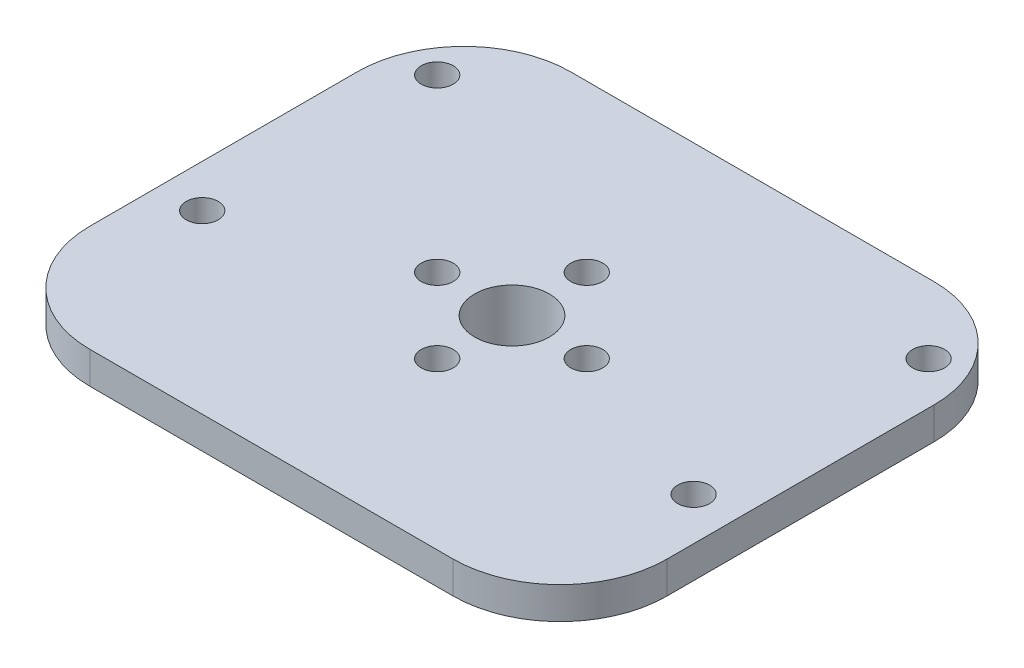
ISO-10303-21;
HEADER;
FILE_DESCRIPTION(('STEP AP214'),'2;1');
FILE_NAME('part.step','',(''),(''),'','','');
FILE_SCHEMA(('AUTOMOTIVE_DESIGN { 1 0 10303 214 1 1 1 1 }'));
ENDSEC;
DATA;
#1=APPLICATION_CONTEXT('core data for automotive mechanical design processes');
#2=APPLICATION_PROTOCOL_DEFINITION('international standard','automotive_design',2000,#1);
#3=PRODUCT_CONTEXT('',#1,'mechanical');
#4=PRODUCT('Part','Part','',(#3));
#5=PRODUCT_RELATED_PRODUCT_CATEGORY('part','',(#4));
#6=PRODUCT_DEFINITION_FORMATION('','',#4);
#7=PRODUCT_DEFINITION_CONTEXT('part definition',#1,'design');
#8=PRODUCT_DEFINITION('design','',#6,#7);
#9=PRODUCT_DEFINITION_SHAPE('','',#8);
#10=(LENGTH_UNIT() NAMED_UNIT(*) SI_UNIT(.MILLI.,.METRE.));
#11=(NAMED_UNIT(*) PLANE_ANGLE_UNIT() SI_UNIT($,.RADIAN.));
#12=(NAMED_UNIT(*) SI_UNIT($,.STERADIAN.) SOLID_ANGLE_UNIT());
#13=UNCERTAINTY_MEASURE_WITH_UNIT(LENGTH_MEASURE(1.E-05),#10,'distance_accuracy_value','');
#14=(GEOMETRIC_REPRESENTATION_CONTEXT(3) GLOBAL_UNCERTAINTY_ASSIGNED_CONTEXT((#13)) GLOBAL_UNIT_ASSIGNED_CONTEXT((#10,
#11,#12)) REPRESENTATION_CONTEXT('',''));
#15=CARTESIAN_POINT('',(0.,0.,0.));
#16=DIRECTION('',(0.,0.,1.));
#17=DIRECTION('',(1.,0.,0.));
#18=AXIS2_PLACEMENT_3D('',#15,#16,#17);
#19=CARTESIAN_POINT('',(0.,0.,0.));
#20=DIRECTION('',(0.,-1.,0.));
#21=DIRECTION('',(0.,0.,-1.));
#22=AXIS2_PLACEMENT_3D('',#19,#20,#21);
#23=PLANE('',#22);
#24=CARTESIAN_POINT('',(-23.,0.,6.));
#25=DIRECTION('',(0.,1.,0.));
#26=DIRECTION('',(0.,0.,1.));
#27=AXIS2_PLACEMENT_3D('',#24,#25,#26);
#28=CIRCLE('',#27,1.5);
#29=CARTESIAN_POINT('',(-23.,0.,7.5));
#30=VERTEX_POINT('',#29);
#31=EDGE_CURVE('E255',#30,#30,#28,.T.);
#32=ORIENTED_EDGE('',*,*,#31,.T.);
#33=EDGE_LOOP('',(#32));
#34=FACE_BOUND('',#33,.T.);
#35=CARTESIAN_POINT('',(23.,0.,-16.));
#36=DIRECTION('',(0.,1.,0.));
#37=DIRECTION('',(0.,0.,1.));
#38=AXIS2_PLACEMENT_3D('',#35,#36,#37);
#39=CIRCLE('',#38,1.5);
#40=CARTESIAN_POINT('',(23.,0.,-14.5));
#41=VERTEX_POINT('',#40);
#42=EDGE_CURVE('E239',#41,#41,#39,.T.);
#43=ORIENTED_EDGE('',*,*,#42,.T.);
#44=EDGE_LOOP('',(#43));
#45=FACE_BOUND('',#44,.T.);
#46=DIRECTION('',(0.,0.,1.));
#47=VECTOR('',#46,1.);
#48=CARTESIAN_POINT('',(-27.,0.,22.5));
#49=LINE('',#48,#47);
#50=CARTESIAN_POINT('',(-27.,0.,-12.5));
#51=VERTEX_POINT('',#50);
#52=CARTESIAN_POINT('',(-27.,0.,12.5));
#53=VERTEX_POINT('',#52);
#54=EDGE_CURVE('E131',#51,#53,#49,.T.);
#55=ORIENTED_EDGE('',*,*,#54,.F.);
#56=CARTESIAN_POINT('',(-17.,0.,-12.5));
#57=DIRECTION('',(0.,-1.,0.));
#58=DIRECTION('',(0.,0.,-1.));
#59=AXIS2_PLACEMENT_3D('',#56,#57,#58);
#60=CIRCLE('',#59,10.);
#61=CARTESIAN_POINT('',(-17.,0.,-22.5));
#62=VERTEX_POINT('',#61);
#63=EDGE_CURVE('E113',#51,#62,#60,.T.);
#64=ORIENTED_EDGE('',*,*,#63,.T.);
#65=DIRECTION('',(-1.,0.,0.));
#66=VECTOR('',#65,1.);
#67=CARTESIAN_POINT('',(-27.,0.,-22.5));
#68=LINE('',#67,#66);
#69=CARTESIAN_POINT('',(17.,0.,-22.5));
#70=VERTEX_POINT('',#69);
#71=EDGE_CURVE('E142',#70,#62,#68,.T.);
#72=ORIENTED_EDGE('',*,*,#71,.F.);
#73=CARTESIAN_POINT('',(17.,0.,-12.5));
#74=DIRECTION('',(0.,-1.,0.));
#75=DIRECTION('',(0.,0.,-1.));
#76=AXIS2_PLACEMENT_3D('',#73,#74,#75);
#77=CIRCLE('',#76,10.);
#78=CARTESIAN_POINT('',(27.,0.,-12.5));
#79=VERTEX_POINT('',#78);
#80=EDGE_CURVE('E157',#70,#79,#77,.T.);
#81=ORIENTED_EDGE('',*,*,#80,.T.);
#82=DIRECTION('',(0.,0.,-1.));
#83=VECTOR('',#82,1.);
#84=CARTESIAN_POINT('',(27.,0.,22.5));
#85=LINE('',#84,#83);
#86=CARTESIAN_POINT('',(27.,0.,12.5));
#87=VERTEX_POINT('',#86);
#88=EDGE_CURVE('E148',#87,#79,#85,.T.);
#89=ORIENTED_EDGE('',*,*,#88,.F.);
#90=CARTESIAN_POINT('',(17.,0.,12.5));
#91=DIRECTION('',(0.,-1.,0.));
#92=DIRECTION('',(0.,0.,-1.));
#93=AXIS2_PLACEMENT_3D('',#90,#91,#92);
#94=CIRCLE('',#93,10.);
#95=CARTESIAN_POINT('',(17.,0.,22.5));
#96=VERTEX_POINT('',#95);
#97=EDGE_CURVE('E135',#87,#96,#94,.T.);
#98=ORIENTED_EDGE('',*,*,#97,.T.);
#99=DIRECTION('',(1.,0.,0.));
#100=VECTOR('',#99,1.);
#101=CARTESIAN_POINT('',(-27.,0.,22.5));
#102=LINE('',#101,#100);
#103=CARTESIAN_POINT('',(-17.,0.,22.5));
#104=VERTEX_POINT('',#103);
#105=EDGE_CURVE('E141',#104,#96,#102,.T.);
#106=ORIENTED_EDGE('',*,*,#105,.F.);
#107=CARTESIAN_POINT('',(-17.,0.,12.5));
#108=DIRECTION('',(0.,-1.,0.));
#109=DIRECTION('',(0.,0.,-1.));
#110=AXIS2_PLACEMENT_3D('',#107,#108,#109);
#111=CIRCLE('',#110,10.);
#112=EDGE_CURVE('E125',#104,#53,#111,.T.);
#113=ORIENTED_EDGE('',*,*,#112,.T.);
#114=EDGE_LOOP('',(#55,#64,#72,#81,#89,#98,#106,#113));
#115=FACE_BOUND('',#114,.T.);
#116=CARTESIAN_POINT('',(23.,0.,6.));
#117=DIRECTION('',(0.,1.,0.));
#118=DIRECTION('',(0.,0.,-1.));
#119=AXIS2_PLACEMENT_3D('',#116,#117,#118);
#120=CIRCLE('',#119,1.5);
#121=CARTESIAN_POINT('',(23.,0.,4.5));
#122=VERTEX_POINT('',#121);
#123=EDGE_CURVE('E247',#122,#122,#120,.T.);
#124=ORIENTED_EDGE('',*,*,#123,.T.);
#125=EDGE_LOOP('',(#124));
#126=FACE_BOUND('',#125,.T.);
#127=CARTESIAN_POINT('',(-23.,0.,-16.));
#128=DIRECTION('',(0.,1.,0.));
#129=DIRECTION('',(0.,0.,-1.));
#130=AXIS2_PLACEMENT_3D('',#127,#128,#129);
#131=CIRCLE('',#130,1.5);
#132=CARTESIAN_POINT('',(-23.,0.,-17.5));
#133=VERTEX_POINT('',#132);
#134=EDGE_CURVE('E263',#133,#133,#131,.T.);
#135=ORIENTED_EDGE('',*,*,#134,.T.);
#136=EDGE_LOOP('',(#135));
#137=FACE_BOUND('',#136,.T.);
#138=CARTESIAN_POINT('',(0.,0.,0.));
#139=DIRECTION('',(0.,-1.,0.));
#140=DIRECTION('',(0.,0.,-1.));
#141=AXIS2_PLACEMENT_3D('',#138,#139,#140);
#142=CIRCLE('',#141,20.);
#143=CARTESIAN_POINT('',(0.,0.,-20.));
#144=VERTEX_POINT('',#143);
#145=EDGE_CURVE('E299',#144,#144,#142,.T.);
#146=ORIENTED_EDGE('',*,*,#145,.F.);
#147=EDGE_LOOP('',(#146));
#148=FACE_BOUND('',#147,.T.);
#149=ADVANCED_FACE('F45',(#34,#45,#115,#126,#137,#148),#23,.T.);
#150=CARTESIAN_POINT('',(0.,-5.,0.));
#151=DIRECTION('',(0.,-1.,0.));
#152=DIRECTION('',(0.,0.,-1.));
#153=AXIS2_PLACEMENT_3D('',#150,#151,#152);
#154=PLANE('',#153);
#155=CARTESIAN_POINT('',(7.,-5.,0.));
#156=DIRECTION('',(0.,-1.,0.));
#157=DIRECTION('',(0.,0.,-1.));
#158=AXIS2_PLACEMENT_3D('',#155,#156,#157);
#159=CIRCLE('',#158,1.5);
#160=CARTESIAN_POINT('',(7.,-5.,-1.5));
#161=VERTEX_POINT('',#160);
#162=EDGE_CURVE('E267',#161,#161,#159,.F.);
#163=ORIENTED_EDGE('',*,*,#162,.T.);
#164=EDGE_LOOP('',(#163));
#165=FACE_BOUND('',#164,.T.);
#166=CARTESIAN_POINT('',(0.,-5.,-7.));
#167=DIRECTION('',(0.,-1.,0.));
#168=DIRECTION('',(0.,0.,-1.));
#169=AXIS2_PLACEMENT_3D('',#166,#167,#168);
#170=CIRCLE('',#169,1.5);
#171=CARTESIAN_POINT('',(0.,-5.,-8.5));
#172=VERTEX_POINT('',#171);
#173=EDGE_CURVE('E274',#172,#172,#170,.F.);
#174=ORIENTED_EDGE('',*,*,#173,.T.);
#175=EDGE_LOOP('',(#174));
#176=FACE_BOUND('',#175,.T.);
#177=CARTESIAN_POINT('',(-7.,-5.,0.));
#178=DIRECTION('',(0.,-1.,0.));
#179=DIRECTION('',(0.,0.,-1.));
#180=AXIS2_PLACEMENT_3D('',#177,#178,#179);
#181=CIRCLE('',#180,1.5);
#182=CARTESIAN_POINT('',(-7.,-5.,-1.5));
#183=VERTEX_POINT('',#182);
#184=EDGE_CURVE('E278',#183,#183,#181,.F.);
#185=ORIENTED_EDGE('',*,*,#184,.T.);
#186=EDGE_LOOP('',(#185));
#187=FACE_BOUND('',#186,.T.);
#188=CARTESIAN_POINT('',(0.,-5.,0.));
#189=DIRECTION('',(0.,-1.,0.));
#190=DIRECTION('',(0.,0.,-1.));
#191=AXIS2_PLACEMENT_3D('',#188,#189,#190);
#192=CIRCLE('',#191,3.5);
#193=CARTESIAN_POINT('',(0.,-5.,-3.49999999999999));
#194=VERTEX_POINT('',#193);
#195=EDGE_CURVE('E282',#194,#194,#192,.F.);
#196=ORIENTED_EDGE('',*,*,#195,.T.);
#197=EDGE_LOOP('',(#196));
#198=FACE_BOUND('',#197,.T.);
#199=CARTESIAN_POINT('',(0.,-5.,7.));
#200=DIRECTION('',(0.,-1.,0.));
#201=DIRECTION('',(0.,0.,-1.));
#202=AXIS2_PLACEMENT_3D('',#199,#200,#201);
#203=CIRCLE('',#202,1.5);
#204=CARTESIAN_POINT('',(0.,-5.,5.5));
#205=VERTEX_POINT('',#204);
#206=EDGE_CURVE('E286',#205,#205,#203,.F.);
#207=ORIENTED_EDGE('',*,*,#206,.T.);
#208=EDGE_LOOP('',(#207));
#209=FACE_BOUND('',#208,.T.);
#210=CARTESIAN_POINT('',(0.,-5.,0.));
#211=DIRECTION('',(0.,-1.,0.));
#212=DIRECTION('',(0.,0.,-1.));
#213=AXIS2_PLACEMENT_3D('',#210,#211,#212);
#214=CIRCLE('',#213,10.5);
#215=CARTESIAN_POINT('',(0.,-5.,-10.5));
#216=VERTEX_POINT('',#215);
#217=EDGE_CURVE('E11',#216,#216,#214,.F.);
#218=ORIENTED_EDGE('',*,*,#217,.F.);
#219=EDGE_LOOP('',(#218));
#220=FACE_BOUND('',#219,.T.);
#221=ADVANCED_FACE('F330',(#165,#176,#187,#198,#209,#220),#154,.T.);
#222=CARTESIAN_POINT('',(0.,3.,0.));
#223=DIRECTION('',(0.,-1.,0.));
#224=DIRECTION('',(0.,0.,-1.));
#225=AXIS2_PLACEMENT_3D('',#222,#223,#224);
#226=PLANE('',#225);
#227=DIRECTION('',(-1.,0.,0.));
#228=VECTOR('',#227,1.);
#229=CARTESIAN_POINT('',(-27.,3.,-22.5));
#230=LINE('',#229,#228);
#231=CARTESIAN_POINT('',(17.,3.,-22.5));
#232=VERTEX_POINT('',#231);
#233=CARTESIAN_POINT('',(-17.,3.,-22.5));
#234=VERTEX_POINT('',#233);
#235=EDGE_CURVE('E204',#232,#234,#230,.T.);
#236=ORIENTED_EDGE('',*,*,#235,.T.);
#237=CARTESIAN_POINT('',(-17.,3.,-12.5));
#238=DIRECTION('',(0.,-1.,0.));
#239=DIRECTION('',(0.,0.,-1.));
#240=AXIS2_PLACEMENT_3D('',#237,#238,#239);
#241=CIRCLE('',#240,10.);
#242=CARTESIAN_POINT('',(-27.,3.,-12.5));
#243=VERTEX_POINT('',#242);
#244=EDGE_CURVE('E175',#234,#243,#241,.F.);
#245=ORIENTED_EDGE('',*,*,#244,.T.);
#246=DIRECTION('',(0.,0.,1.));
#247=VECTOR('',#246,1.);
#248=CARTESIAN_POINT('',(-27.,3.,22.5));
#249=LINE('',#248,#247);
#250=CARTESIAN_POINT('',(-27.,3.,12.5));
#251=VERTEX_POINT('',#250);
#252=EDGE_CURVE('E133',#243,#251,#249,.T.);
#253=ORIENTED_EDGE('',*,*,#252,.T.);
#254=CARTESIAN_POINT('',(-17.,3.,12.5));
#255=DIRECTION('',(0.,-1.,0.));
#256=DIRECTION('',(0.,0.,-1.));
#257=AXIS2_PLACEMENT_3D('',#254,#255,#256);
#258=CIRCLE('',#257,10.);
#259=CARTESIAN_POINT('',(-17.,3.,22.5));
#260=VERTEX_POINT('',#259);
#261=EDGE_CURVE('E68',#251,#260,#258,.F.);
#262=ORIENTED_EDGE('',*,*,#261,.T.);
#263=DIRECTION('',(1.,0.,0.));
#264=VECTOR('',#263,1.);
#265=CARTESIAN_POINT('',(-27.,3.,22.5));
#266=LINE('',#265,#264);
#267=CARTESIAN_POINT('',(17.,3.,22.5));
#268=VERTEX_POINT('',#267);
#269=EDGE_CURVE('E153',#260,#268,#266,.T.);
#270=ORIENTED_EDGE('',*,*,#269,.T.);
#271=CARTESIAN_POINT('',(17.,3.,12.5));
#272=DIRECTION('',(0.,-1.,0.));
#273=DIRECTION('',(0.,0.,-1.));
#274=AXIS2_PLACEMENT_3D('',#271,#272,#273);
#275=CIRCLE('',#274,10.);
#276=CARTESIAN_POINT('',(27.,3.,12.5));
#277=VERTEX_POINT('',#276);
#278=EDGE_CURVE('E167',#268,#277,#275,.F.);
#279=ORIENTED_EDGE('',*,*,#278,.T.);
#280=DIRECTION('',(0.,0.,-1.));
#281=VECTOR('',#280,1.);
#282=CARTESIAN_POINT('',(27.,3.,22.5));
#283=LINE('',#282,#281);
#284=CARTESIAN_POINT('',(27.,3.,-12.5));
#285=VERTEX_POINT('',#284);
#286=EDGE_CURVE('E146',#277,#285,#283,.T.);
#287=ORIENTED_EDGE('',*,*,#286,.T.);
#288=CARTESIAN_POINT('',(17.,3.,-12.5));
#289=DIRECTION('',(0.,-1.,0.));
#290=DIRECTION('',(0.,0.,-1.));
#291=AXIS2_PLACEMENT_3D('',#288,#289,#290);
#292=CIRCLE('',#291,10.);
#293=EDGE_CURVE('E170',#285,#232,#292,.F.);
#294=ORIENTED_EDGE('',*,*,#293,.T.);
#295=EDGE_LOOP('',(#236,#245,#253,#262,#270,#279,#287,#294));
#296=FACE_BOUND('',#295,.T.);
#297=CARTESIAN_POINT('',(0.,3.,-7.));
#298=DIRECTION('',(0.,1.,0.));
#299=DIRECTION('',(0.,0.,1.));
#300=AXIS2_PLACEMENT_3D('',#297,#298,#299);
#301=CIRCLE('',#300,1.5);
#302=CARTESIAN_POINT('',(0.,3.,-5.5));
#303=VERTEX_POINT('',#302);
#304=EDGE_CURVE('E211',#303,#303,#301,.T.);
#305=ORIENTED_EDGE('',*,*,#304,.F.);
#306=EDGE_LOOP('',(#305));
#307=FACE_BOUND('',#306,.T.);
#308=CARTESIAN_POINT('',(7.,3.,0.));
#309=DIRECTION('',(0.,1.,0.));
#310=DIRECTION('',(0.,0.,1.));
#311=AXIS2_PLACEMENT_3D('',#308,#309,#310);
#312=CIRCLE('',#311,1.5);
#313=CARTESIAN_POINT('',(7.,3.,1.5));
#314=VERTEX_POINT('',#313);
#315=EDGE_CURVE('E214',#314,#314,#312,.T.);
#316=ORIENTED_EDGE('',*,*,#315,.F.);
#317=EDGE_LOOP('',(#316));
#318=FACE_BOUND('',#317,.T.);
#319=CARTESIAN_POINT('',(0.,3.,0.));
#320=DIRECTION('',(0.,1.,0.));
#321=DIRECTION('',(0.,0.,1.));
#322=AXIS2_PLACEMENT_3D('',#319,#320,#321);
#323=CIRCLE('',#322,3.5);
#324=CARTESIAN_POINT('',(0.,3.,3.50000000000001));
#325=VERTEX_POINT('',#324);
#326=EDGE_CURVE('E226',#325,#325,#323,.T.);
#327=ORIENTED_EDGE('',*,*,#326,.F.);
#328=EDGE_LOOP('',(#327));
#329=FACE_BOUND('',#328,.T.);
#330=CARTESIAN_POINT('',(0.,3.,7.));
#331=DIRECTION('',(0.,1.,0.));
#332=DIRECTION('',(0.,0.,-1.));
#333=AXIS2_PLACEMENT_3D('',#330,#331,#332);
#334=CIRCLE('',#333,1.5);
#335=CARTESIAN_POINT('',(0.,3.,5.5));
#336=VERTEX_POINT('',#335);
#337=EDGE_CURVE('E230',#336,#336,#334,.T.);
#338=ORIENTED_EDGE('',*,*,#337,.F.);
#339=EDGE_LOOP('',(#338));
#340=FACE_BOUND('',#339,.T.);
#341=CARTESIAN_POINT('',(-7.,3.,0.));
#342=DIRECTION('',(0.,1.,0.));
#343=DIRECTION('',(0.,0.,-1.));
#344=AXIS2_PLACEMENT_3D('',#341,#342,#343);
#345=CIRCLE('',#344,1.5);
#346=CARTESIAN_POINT('',(-7.,3.,-1.5));
#347=VERTEX_POINT('',#346);
#348=EDGE_CURVE('E234',#347,#347,#345,.T.);
#349=ORIENTED_EDGE('',*,*,#348,.F.);
#350=EDGE_LOOP('',(#349));
#351=FACE_BOUND('',#350,.T.);
#352=CARTESIAN_POINT('',(23.,3.,-16.));
#353=DIRECTION('',(0.,1.,0.));
#354=DIRECTION('',(0.,0.,1.));
#355=AXIS2_PLACEMENT_3D('',#352,#353,#354);
#356=CIRCLE('',#355,1.5);
#357=CARTESIAN_POINT('',(23.,3.,-14.5));
#358=VERTEX_POINT('',#357);
#359=EDGE_CURVE('E238',#358,#358,#356,.T.);
#360=ORIENTED_EDGE('',*,*,#359,.F.);
#361=EDGE_LOOP('',(#360));
#362=FACE_BOUND('',#361,.T.);
#363=CARTESIAN_POINT('',(23.,3.,6.));
#364=DIRECTION('',(0.,1.,0.));
#365=DIRECTION('',(0.,0.,-1.));
#366=AXIS2_PLACEMENT_3D('',#363,#364,#365);
#367=CIRCLE('',#366,1.5);
#368=CARTESIAN_POINT('',(23.,3.,4.5));
#369=VERTEX_POINT('',#368);
#370=EDGE_CURVE('E243',#369,#369,#367,.T.);
#371=ORIENTED_EDGE('',*,*,#370,.F.);
#372=EDGE_LOOP('',(#371));
#373=FACE_BOUND('',#372,.T.);
#374=CARTESIAN_POINT('',(-23.,3.,6.));
#375=DIRECTION('',(0.,1.,0.));
#376=DIRECTION('',(0.,0.,1.));
#377=AXIS2_PLACEMENT_3D('',#374,#375,#376);
#378=CIRCLE('',#377,1.5);
#379=CARTESIAN_POINT('',(-23.,3.,7.5));
#380=VERTEX_POINT('',#379);
#381=EDGE_CURVE('E251',#380,#380,#378,.T.);
#382=ORIENTED_EDGE('',*,*,#381,.F.);
#383=EDGE_LOOP('',(#382));
#384=FACE_BOUND('',#383,.T.);
#385=CARTESIAN_POINT('',(-23.,3.,-16.));
#386=DIRECTION('',(0.,1.,0.));
#387=DIRECTION('',(0.,0.,-1.));
#388=AXIS2_PLACEMENT_3D('',#385,#386,#387);
#389=CIRCLE('',#388,1.5);
#390=CARTESIAN_POINT('',(-23.,3.,-17.5));
#391=VERTEX_POINT('',#390);
#392=EDGE_CURVE('E259',#391,#391,#389,.T.);
#393=ORIENTED_EDGE('',*,*,#392,.F.);
#394=EDGE_LOOP('',(#393));
#395=FACE_BOUND('',#394,.T.);
#396=ADVANCED_FACE('F199',(#296,#307,#318,#329,#340,#351,#362,#373,#384,#395),#226,.F.);
#397=CARTESIAN_POINT('',(27.,3.,22.5));
#398=DIRECTION('',(-1.,0.,0.));
#399=DIRECTION('',(0.,0.,1.));
#400=AXIS2_PLACEMENT_3D('',#397,#398,#399);
#401=PLANE('',#400);
#402=ORIENTED_EDGE('',*,*,#88,.T.);
#403=DIRECTION('',(0.,-1.,0.));
#404=VECTOR('',#403,1.);
#405=CARTESIAN_POINT('',(27.,3.,-12.5));
#406=LINE('',#405,#404);
#407=EDGE_CURVE('E54',#79,#285,#406,.F.);
#408=ORIENTED_EDGE('',*,*,#407,.T.);
#409=ORIENTED_EDGE('',*,*,#286,.F.);
#410=DIRECTION('',(0.,-1.,0.));
#411=VECTOR('',#410,1.);
#412=CARTESIAN_POINT('',(27.,3.,12.5));
#413=LINE('',#412,#411);
#414=EDGE_CURVE('E184',#277,#87,#413,.T.);
#415=ORIENTED_EDGE('',*,*,#414,.T.);
#416=EDGE_LOOP('',(#402,#408,#409,#415));
#417=FACE_BOUND('',#416,.T.);
#418=ADVANCED_FACE('F193',(#417),#401,.F.);
#419=CARTESIAN_POINT('',(-27.,3.,-22.5));
#420=DIRECTION('',(0.,0.,1.));
#421=DIRECTION('',(1.,0.,0.));
#422=AXIS2_PLACEMENT_3D('',#419,#420,#421);
#423=PLANE('',#422);
#424=ORIENTED_EDGE('',*,*,#71,.T.);
#425=DIRECTION('',(0.,-1.,0.));
#426=VECTOR('',#425,1.);
#427=CARTESIAN_POINT('',(-17.,3.,-22.5));
#428=LINE('',#427,#426);
#429=EDGE_CURVE('E118',#62,#234,#428,.F.);
#430=ORIENTED_EDGE('',*,*,#429,.T.);
#431=ORIENTED_EDGE('',*,*,#235,.F.);
#432=DIRECTION('',(0.,-1.,0.));
#433=VECTOR('',#432,1.);
#434=CARTESIAN_POINT('',(17.,3.,-22.5));
#435=LINE('',#434,#433);
#436=EDGE_CURVE('E124',#232,#70,#435,.T.);
#437=ORIENTED_EDGE('',*,*,#436,.T.);
#438=EDGE_LOOP('',(#424,#430,#431,#437));
#439=FACE_BOUND('',#438,.T.);
#440=ADVANCED_FACE('F209',(#439),#423,.F.);
#441=CARTESIAN_POINT('',(-27.,3.,22.5));
#442=DIRECTION('',(1.,0.,0.));
#443=DIRECTION('',(0.,0.,-1.));
#444=AXIS2_PLACEMENT_3D('',#441,#442,#443);
#445=PLANE('',#444);
#446=ORIENTED_EDGE('',*,*,#252,.F.);
#447=DIRECTION('',(0.,-1.,0.));
#448=VECTOR('',#447,1.);
#449=CARTESIAN_POINT('',(-27.,3.,-12.5));
#450=LINE('',#449,#448);
#451=EDGE_CURVE('E117',#243,#51,#450,.T.);
#452=ORIENTED_EDGE('',*,*,#451,.T.);
#453=ORIENTED_EDGE('',*,*,#54,.T.);
#454=DIRECTION('',(0.,-1.,0.));
#455=VECTOR('',#454,1.);
#456=CARTESIAN_POINT('',(-27.,3.,12.5));
#457=LINE('',#456,#455);
#458=EDGE_CURVE('E136',#53,#251,#457,.F.);
#459=ORIENTED_EDGE('',*,*,#458,.T.);
#460=EDGE_LOOP('',(#446,#452,#453,#459));
#461=FACE_BOUND('',#460,.T.);
#462=ADVANCED_FACE('F130',(#461),#445,.F.);
#463=CARTESIAN_POINT('',(-27.,3.,22.5));
#464=DIRECTION('',(0.,0.,-1.));
#465=DIRECTION('',(-1.,0.,0.));
#466=AXIS2_PLACEMENT_3D('',#463,#464,#465);
#467=PLANE('',#466);
#468=ORIENTED_EDGE('',*,*,#269,.F.);
#469=DIRECTION('',(0.,-1.,0.));
#470=VECTOR('',#469,1.);
#471=CARTESIAN_POINT('',(-17.,3.,22.5));
#472=LINE('',#471,#470);
#473=EDGE_CURVE('E180',#260,#104,#472,.T.);
#474=ORIENTED_EDGE('',*,*,#473,.T.);
#475=ORIENTED_EDGE('',*,*,#105,.T.);
#476=DIRECTION('',(0.,-1.,0.));
#477=VECTOR('',#476,1.);
#478=CARTESIAN_POINT('',(17.,3.,22.5));
#479=LINE('',#478,#477);
#480=EDGE_CURVE('E61',#96,#268,#479,.F.);
#481=ORIENTED_EDGE('',*,*,#480,.T.);
#482=EDGE_LOOP('',(#468,#474,#475,#481));
#483=FACE_BOUND('',#482,.T.);
#484=ADVANCED_FACE('F342',(#483),#467,.F.);
#485=CARTESIAN_POINT('',(0.,3.,-7.));
#486=DIRECTION('',(0.,-1.,0.));
#487=DIRECTION('',(0.,0.,-1.));
#488=AXIS2_PLACEMENT_3D('',#485,#486,#487);
#489=CYLINDRICAL_SURFACE('',#488,1.5);
#490=ORIENTED_EDGE('',*,*,#304,.T.);
#491=EDGE_LOOP('',(#490));
#492=FACE_BOUND('',#491,.T.);
#493=ORIENTED_EDGE('',*,*,#173,.F.);
#494=EDGE_LOOP('',(#493));
#495=FACE_BOUND('',#494,.T.);
#496=ADVANCED_FACE('F345',(#492,#495),#489,.F.);
#497=CARTESIAN_POINT('',(7.,3.,0.));
#498=DIRECTION('',(0.,-1.,0.));
#499=DIRECTION('',(0.,0.,-1.));
#500=AXIS2_PLACEMENT_3D('',#497,#498,#499);
#501=CYLINDRICAL_SURFACE('',#500,1.5);
#502=ORIENTED_EDGE('',*,*,#315,.T.);
#503=EDGE_LOOP('',(#502));
#504=FACE_BOUND('',#503,.T.);
#505=ORIENTED_EDGE('',*,*,#162,.F.);
#506=EDGE_LOOP('',(#505));
#507=FACE_BOUND('',#506,.T.);
#508=ADVANCED_FACE('F399',(#504,#507),#501,.F.);
#509=CARTESIAN_POINT('',(0.,3.,0.));
#510=DIRECTION('',(0.,-1.,0.));
#511=DIRECTION('',(0.,0.,-1.));
#512=AXIS2_PLACEMENT_3D('',#509,#510,#511);
#513=CYLINDRICAL_SURFACE('',#512,3.5);
#514=ORIENTED_EDGE('',*,*,#326,.T.);
#515=EDGE_LOOP('',(#514));
#516=FACE_BOUND('',#515,.T.);
#517=ORIENTED_EDGE('',*,*,#195,.F.);
#518=EDGE_LOOP('',(#517));
#519=FACE_BOUND('',#518,.T.);
#520=ADVANCED_FACE('F395',(#516,#519),#513,.F.);
#521=CARTESIAN_POINT('',(0.,3.,7.));
#522=DIRECTION('',(0.,-1.,0.));
#523=DIRECTION('',(0.,0.,-1.));
#524=AXIS2_PLACEMENT_3D('',#521,#522,#523);
#525=CYLINDRICAL_SURFACE('',#524,1.5);
#526=ORIENTED_EDGE('',*,*,#337,.T.);
#527=EDGE_LOOP('',(#526));
#528=FACE_BOUND('',#527,.T.);
#529=ORIENTED_EDGE('',*,*,#206,.F.);
#530=EDGE_LOOP('',(#529));
#531=FACE_BOUND('',#530,.T.);
#532=ADVANCED_FACE('F391',(#528,#531),#525,.F.);
#533=CARTESIAN_POINT('',(-7.,3.,0.));
#534=DIRECTION('',(0.,-1.,0.));
#535=DIRECTION('',(0.,0.,-1.));
#536=AXIS2_PLACEMENT_3D('',#533,#534,#535);
#537=CYLINDRICAL_SURFACE('',#536,1.5);
#538=ORIENTED_EDGE('',*,*,#348,.T.);
#539=EDGE_LOOP('',(#538));
#540=FACE_BOUND('',#539,.T.);
#541=ORIENTED_EDGE('',*,*,#184,.F.);
#542=EDGE_LOOP('',(#541));
#543=FACE_BOUND('',#542,.T.);
#544=ADVANCED_FACE('F387',(#540,#543),#537,.F.);
#545=CARTESIAN_POINT('',(23.,3.,-16.));
#546=DIRECTION('',(0.,-1.,0.));
#547=DIRECTION('',(0.,0.,-1.));
#548=AXIS2_PLACEMENT_3D('',#545,#546,#547);
#549=CYLINDRICAL_SURFACE('',#548,1.5);
#550=ORIENTED_EDGE('',*,*,#359,.T.);
#551=EDGE_LOOP('',(#550));
#552=FACE_BOUND('',#551,.T.);
#553=ORIENTED_EDGE('',*,*,#42,.F.);
#554=EDGE_LOOP('',(#553));
#555=FACE_BOUND('',#554,.T.);
#556=ADVANCED_FACE('F383',(#552,#555),#549,.F.);
#557=CARTESIAN_POINT('',(23.,3.,6.));
#558=DIRECTION('',(0.,-1.,0.));
#559=DIRECTION('',(0.,0.,-1.));
#560=AXIS2_PLACEMENT_3D('',#557,#558,#559);
#561=CYLINDRICAL_SURFACE('',#560,1.5);
#562=ORIENTED_EDGE('',*,*,#370,.T.);
#563=EDGE_LOOP('',(#562));
#564=FACE_BOUND('',#563,.T.);
#565=ORIENTED_EDGE('',*,*,#123,.F.);
#566=EDGE_LOOP('',(#565));
#567=FACE_BOUND('',#566,.T.);
#568=ADVANCED_FACE('F379',(#564,#567),#561,.F.);
#569=CARTESIAN_POINT('',(-23.,3.,6.));
#570=DIRECTION('',(0.,-1.,0.));
#571=DIRECTION('',(0.,0.,-1.));
#572=AXIS2_PLACEMENT_3D('',#569,#570,#571);
#573=CYLINDRICAL_SURFACE('',#572,1.5);
#574=ORIENTED_EDGE('',*,*,#381,.T.);
#575=EDGE_LOOP('',(#574));
#576=FACE_BOUND('',#575,.T.);
#577=ORIENTED_EDGE('',*,*,#31,.F.);
#578=EDGE_LOOP('',(#577));
#579=FACE_BOUND('',#578,.T.);
#580=ADVANCED_FACE('F375',(#576,#579),#573,.F.);
#581=CARTESIAN_POINT('',(-23.,3.,-16.));
#582=DIRECTION('',(0.,-1.,0.));
#583=DIRECTION('',(0.,0.,-1.));
#584=AXIS2_PLACEMENT_3D('',#581,#582,#583);
#585=CYLINDRICAL_SURFACE('',#584,1.5);
#586=ORIENTED_EDGE('',*,*,#392,.T.);
#587=EDGE_LOOP('',(#586));
#588=FACE_BOUND('',#587,.T.);
#589=ORIENTED_EDGE('',*,*,#134,.F.);
#590=EDGE_LOOP('',(#589));
#591=FACE_BOUND('',#590,.T.);
#592=ADVANCED_FACE('F355',(#588,#591),#585,.F.);
#593=CARTESIAN_POINT('',(-17.,3.,-12.5));
#594=DIRECTION('',(0.,-1.,0.));
#595=DIRECTION('',(0.,0.,-1.));
#596=AXIS2_PLACEMENT_3D('',#593,#594,#595);
#597=CYLINDRICAL_SURFACE('',#596,10.);
#598=ORIENTED_EDGE('',*,*,#244,.F.);
#599=ORIENTED_EDGE('',*,*,#429,.F.);
#600=ORIENTED_EDGE('',*,*,#63,.F.);
#601=ORIENTED_EDGE('',*,*,#451,.F.);
#602=EDGE_LOOP('',(#598,#599,#600,#601));
#603=FACE_BOUND('',#602,.T.);
#604=ADVANCED_FACE('F116',(#603),#597,.T.);
#605=CARTESIAN_POINT('',(-17.,3.,12.5));
#606=DIRECTION('',(0.,-1.,0.));
#607=DIRECTION('',(0.,0.,-1.));
#608=AXIS2_PLACEMENT_3D('',#605,#606,#607);
#609=CYLINDRICAL_SURFACE('',#608,10.);
#610=ORIENTED_EDGE('',*,*,#261,.F.);
#611=ORIENTED_EDGE('',*,*,#458,.F.);
#612=ORIENTED_EDGE('',*,*,#112,.F.);
#613=ORIENTED_EDGE('',*,*,#473,.F.);
#614=EDGE_LOOP('',(#610,#611,#612,#613));
#615=FACE_BOUND('',#614,.T.);
#616=ADVANCED_FACE('F354',(#615),#609,.T.);
#617=CARTESIAN_POINT('',(17.,3.,-12.5));
#618=DIRECTION('',(0.,-1.,0.));
#619=DIRECTION('',(0.,0.,-1.));
#620=AXIS2_PLACEMENT_3D('',#617,#618,#619);
#621=CYLINDRICAL_SURFACE('',#620,10.);
#622=ORIENTED_EDGE('',*,*,#293,.F.);
#623=ORIENTED_EDGE('',*,*,#407,.F.);
#624=ORIENTED_EDGE('',*,*,#80,.F.);
#625=ORIENTED_EDGE('',*,*,#436,.F.);
#626=EDGE_LOOP('',(#622,#623,#624,#625));
#627=FACE_BOUND('',#626,.T.);
#628=ADVANCED_FACE('F207',(#627),#621,.T.);
#629=CARTESIAN_POINT('',(17.,3.,12.5));
#630=DIRECTION('',(0.,-1.,0.));
#631=DIRECTION('',(0.,0.,-1.));
#632=AXIS2_PLACEMENT_3D('',#629,#630,#631);
#633=CYLINDRICAL_SURFACE('',#632,10.);
#634=ORIENTED_EDGE('',*,*,#278,.F.);
#635=ORIENTED_EDGE('',*,*,#480,.F.);
#636=ORIENTED_EDGE('',*,*,#97,.F.);
#637=ORIENTED_EDGE('',*,*,#414,.F.);
#638=EDGE_LOOP('',(#634,#635,#636,#637));
#639=FACE_BOUND('',#638,.T.);
#640=ADVANCED_FACE('F47',(#639),#633,.T.);
#641=CARTESIAN_POINT('',(0.,-5.,0.));
#642=DIRECTION('',(0.,1.,0.));
#643=DIRECTION('',(0.,0.,1.));
#644=AXIS2_PLACEMENT_3D('',#641,#642,#643);
#645=CYLINDRICAL_SURFACE('',#644,12.);
#646=CARTESIAN_POINT('',(0.,-2.,0.));
#647=DIRECTION('',(0.,-1.,0.));
#648=DIRECTION('',(0.,0.,-1.));
#649=AXIS2_PLACEMENT_3D('',#646,#647,#648);
#650=CIRCLE('',#649,12.);
#651=CARTESIAN_POINT('',(0.,-2.,-12.));
#652=VERTEX_POINT('',#651);
#653=EDGE_CURVE('E303',#652,#652,#650,.T.);
#654=ORIENTED_EDGE('',*,*,#653,.T.);
#655=EDGE_LOOP('',(#654));
#656=FACE_BOUND('',#655,.T.);
#657=CARTESIAN_POINT('',(0.,-9.,0.));
#658=DIRECTION('',(0.,-1.,0.));
#659=DIRECTION('',(0.,0.,-1.));
#660=AXIS2_PLACEMENT_3D('',#657,#658,#659);
#661=CIRCLE('',#660,12.);
#662=CARTESIAN_POINT('',(0.,-9.,-12.));
#663=VERTEX_POINT('',#662);
#664=EDGE_CURVE('E290',#663,#663,#661,.T.);
#665=ORIENTED_EDGE('',*,*,#664,.F.);
#666=EDGE_LOOP('',(#665));
#667=FACE_BOUND('',#666,.T.);
#668=ADVANCED_FACE('F311',(#656,#667),#645,.T.);
#669=CARTESIAN_POINT('',(0.,-9.,0.));
#670=DIRECTION('',(0.,-1.,0.));
#671=DIRECTION('',(0.,0.,-1.));
#672=AXIS2_PLACEMENT_3D('',#669,#670,#671);
#673=PLANE('',#672);
#674=ORIENTED_EDGE('',*,*,#664,.T.);
#675=EDGE_LOOP('',(#674));
#676=FACE_BOUND('',#675,.T.);
#677=CARTESIAN_POINT('',(0.,-9.,0.));
#678=DIRECTION('',(0.,-1.,0.));
#679=DIRECTION('',(0.,0.,-1.));
#680=AXIS2_PLACEMENT_3D('',#677,#678,#679);
#681=CIRCLE('',#680,10.5);
#682=CARTESIAN_POINT('',(0.,-9.,-10.5));
#683=VERTEX_POINT('',#682);
#684=EDGE_CURVE('E294',#683,#683,#681,.T.);
#685=ORIENTED_EDGE('',*,*,#684,.F.);
#686=EDGE_LOOP('',(#685));
#687=FACE_BOUND('',#686,.T.);
#688=ADVANCED_FACE('F326',(#676,#687),#673,.T.);
#689=CARTESIAN_POINT('',(0.,-9.,0.));
#690=DIRECTION('',(0.,1.,0.));
#691=DIRECTION('',(0.,0.,1.));
#692=AXIS2_PLACEMENT_3D('',#689,#690,#691);
#693=CYLINDRICAL_SURFACE('',#692,10.5);
#694=ORIENTED_EDGE('',*,*,#684,.T.);
#695=EDGE_LOOP('',(#694));
#696=FACE_BOUND('',#695,.T.);
#697=ORIENTED_EDGE('',*,*,#217,.T.);
#698=EDGE_LOOP('',(#697));
#699=FACE_BOUND('',#698,.T.);
#700=ADVANCED_FACE('F317',(#696,#699),#693,.F.);
#701=CARTESIAN_POINT('',(0.,-2.,0.));
#702=DIRECTION('',(0.,-1.,0.));
#703=DIRECTION('',(0.,0.,-1.));
#704=AXIS2_PLACEMENT_3D('',#701,#702,#703);
#705=PLANE('',#704);
#706=CARTESIAN_POINT('',(0.,-2.,0.));
#707=DIRECTION('',(0.,-1.,0.));
#708=DIRECTION('',(0.,0.,-1.));
#709=AXIS2_PLACEMENT_3D('',#706,#707,#708);
#710=CIRCLE('',#709,20.);
#711=CARTESIAN_POINT('',(0.,-2.,-20.));
#712=VERTEX_POINT('',#711);
#713=EDGE_CURVE('E298',#712,#712,#710,.T.);
#714=ORIENTED_EDGE('',*,*,#713,.T.);
#715=EDGE_LOOP('',(#714));
#716=FACE_BOUND('',#715,.T.);
#717=ORIENTED_EDGE('',*,*,#653,.F.);
#718=EDGE_LOOP('',(#717));
#719=FACE_BOUND('',#718,.T.);
#720=ADVANCED_FACE('F314',(#716,#719),#705,.T.);
#721=CARTESIAN_POINT('',(0.,-2.,0.));
#722=DIRECTION('',(0.,1.,0.));
#723=DIRECTION('',(0.,0.,1.));
#724=AXIS2_PLACEMENT_3D('',#721,#722,#723);
#725=CYLINDRICAL_SURFACE('',#724,20.);
#726=ORIENTED_EDGE('',*,*,#713,.F.);
#727=EDGE_LOOP('',(#726));
#728=FACE_BOUND('',#727,.T.);
#729=ORIENTED_EDGE('',*,*,#145,.T.);
#730=EDGE_LOOP('',(#729));
#731=FACE_BOUND('',#730,.T.);
#732=ADVANCED_FACE('F316',(#728,#731),#725,.T.);
#733=CLOSED_SHELL('',(#149,#221,#396,#418,#440,#462,#484,#496,#508,#520,#532,#544,#556,#568,
#580,#592,#604,#616,#628,#640,#668,#688,#700,#720,#732));
#734=MANIFOLD_SOLID_BREP('B2',#733);
#735=ADVANCED_BREP_SHAPE_REPRESENTATION('',(#18,#734),#14);
#736=SHAPE_DEFINITION_REPRESENTATION(#9,#735);
ENDSEC;
END-ISO-10303-21;
